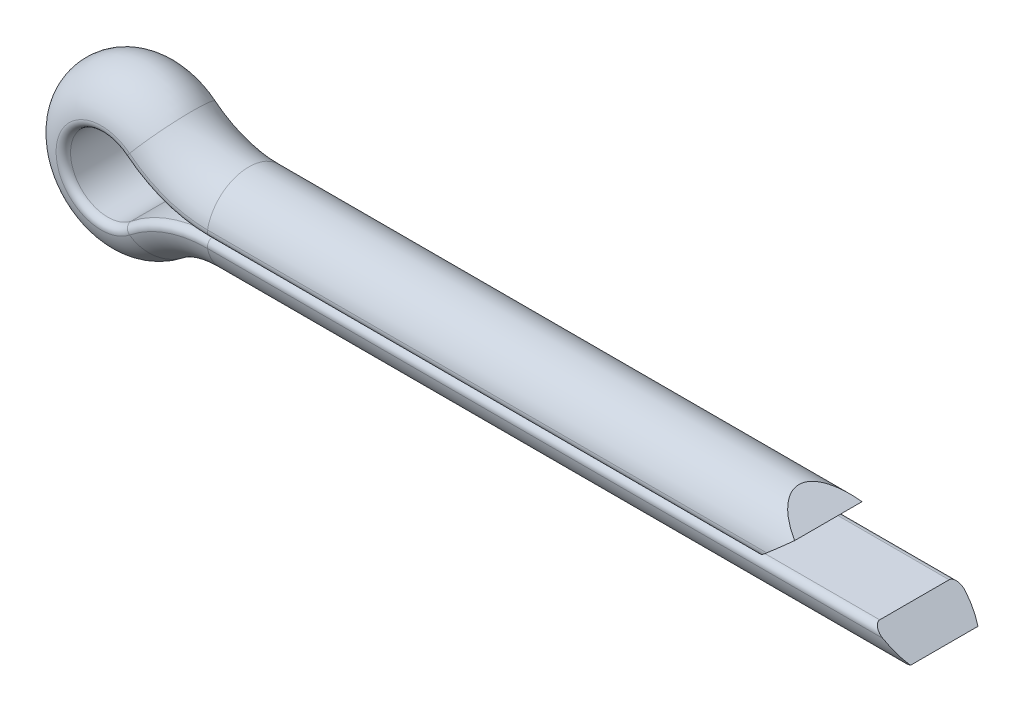
ISO-10303-21;
HEADER;
FILE_DESCRIPTION(('STEP AP214'),'2;1');
FILE_NAME('part.step','',(''),(''),'','','');
FILE_SCHEMA(('AUTOMOTIVE_DESIGN { 1 0 10303 214 1 1 1 1 }'));
ENDSEC;
DATA;
#1=APPLICATION_CONTEXT('core data for automotive mechanical design processes');
#2=APPLICATION_PROTOCOL_DEFINITION('international standard','automotive_design',2000,#1);
#3=PRODUCT_CONTEXT('',#1,'mechanical');
#4=PRODUCT('Part','Part','',(#3));
#5=PRODUCT_RELATED_PRODUCT_CATEGORY('part','',(#4));
#6=PRODUCT_DEFINITION_FORMATION('','',#4);
#7=PRODUCT_DEFINITION_CONTEXT('part definition',#1,'design');
#8=PRODUCT_DEFINITION('design','',#6,#7);
#9=PRODUCT_DEFINITION_SHAPE('','',#8);
#10=(LENGTH_UNIT() NAMED_UNIT(*) SI_UNIT(.MILLI.,.METRE.));
#11=(NAMED_UNIT(*) PLANE_ANGLE_UNIT() SI_UNIT($,.RADIAN.));
#12=(NAMED_UNIT(*) SI_UNIT($,.STERADIAN.) SOLID_ANGLE_UNIT());
#13=UNCERTAINTY_MEASURE_WITH_UNIT(LENGTH_MEASURE(1.E-05),#10,'distance_accuracy_value','');
#14=(GEOMETRIC_REPRESENTATION_CONTEXT(3) GLOBAL_UNCERTAINTY_ASSIGNED_CONTEXT((#13)) GLOBAL_UNIT_ASSIGNED_CONTEXT((#10,
#11,#12)) REPRESENTATION_CONTEXT('',''));
#15=CARTESIAN_POINT('',(0.,0.,0.));
#16=DIRECTION('',(0.,0.,1.));
#17=DIRECTION('',(1.,0.,0.));
#18=AXIS2_PLACEMENT_3D('',#15,#16,#17);
#19=CARTESIAN_POINT('',(3.66500000000001,0.,0.));
#20=DIRECTION('',(1.,0.,0.));
#21=DIRECTION('',(0.,0.,-1.));
#22=AXIS2_PLACEMENT_3D('',#19,#20,#21);
#23=CYLINDRICAL_SURFACE('',#22,1.45);
#24=CARTESIAN_POINT('',(29.1549658100971,0.,0.));
#25=DIRECTION('',(-0.501148088783706,0.865361538958393,0.));
#26=DIRECTION('',(0.865361538958393,0.501148088783706,0.));
#27=AXIS2_PLACEMENT_3D('',#24,#25,#26);
#28=ELLIPSE('',#27,2.89335634007739,1.45);
#29=CARTESIAN_POINT('',(27.665,-0.862868852459016,-1.16531426810799));
#30=VERTEX_POINT('',#29);
#31=CARTESIAN_POINT('',(27.665,-0.862868852459016,1.16531426810799));
#32=VERTEX_POINT('',#31);
#33=EDGE_CURVE('E171',#30,#32,#28,.T.);
#34=ORIENTED_EDGE('',*,*,#33,.T.);
#35=CARTESIAN_POINT('',(26.6338989335464,0.,0.));
#36=DIRECTION('',(-0.641771111317948,-0.766896238534084,0.));
#37=DIRECTION('',(0.766896238534084,-0.641771111317948,0.));
#38=AXIS2_PLACEMENT_3D('',#35,#36,#37);
#39=ELLIPSE('',#38,2.25937249967869,1.45);
#40=CARTESIAN_POINT('',(26.9633967950027,-0.275737704918033,1.42354090846963));
#41=VERTEX_POINT('',#40);
#42=EDGE_CURVE('E170',#32,#41,#39,.T.);
#43=ORIENTED_EDGE('',*,*,#42,.T.);
#44=DIRECTION('',(1.,0.,0.));
#45=VECTOR('',#44,1.);
#46=CARTESIAN_POINT('',(3.66500000000002,-0.275737704918033,1.42354090846963));
#47=LINE('',#46,#45);
#48=CARTESIAN_POINT('',(3.66500000000002,-0.275737704918033,1.42354090846963));
#49=VERTEX_POINT('',#48);
#50=EDGE_CURVE('E11',#49,#41,#47,.T.);
#51=ORIENTED_EDGE('',*,*,#50,.F.);
#52=CARTESIAN_POINT('',(3.66500000000001,0.,0.));
#53=DIRECTION('',(-1.,0.,0.));
#54=DIRECTION('',(0.,0.,-1.));
#55=AXIS2_PLACEMENT_3D('',#52,#53,#54);
#56=CIRCLE('',#55,1.45);
#57=CARTESIAN_POINT('',(3.66500000000002,-0.275737704918033,-1.42354090846963));
#58=VERTEX_POINT('',#57);
#59=EDGE_CURVE('E253',#58,#49,#56,.T.);
#60=ORIENTED_EDGE('',*,*,#59,.F.);
#61=DIRECTION('',(1.,0.,0.));
#62=VECTOR('',#61,1.);
#63=CARTESIAN_POINT('',(3.66500000000002,-0.275737704918033,-1.42354090846963));
#64=LINE('',#63,#62);
#65=CARTESIAN_POINT('',(26.9633967950027,-0.275737704918033,-1.42354090846963));
#66=VERTEX_POINT('',#65);
#67=EDGE_CURVE('E45',#58,#66,#64,.T.);
#68=ORIENTED_EDGE('',*,*,#67,.T.);
#69=EDGE_CURVE('E167',#66,#30,#39,.T.);
#70=ORIENTED_EDGE('',*,*,#69,.T.);
#71=EDGE_LOOP('',(#34,#43,#51,#60,#68,#70));
#72=FACE_BOUND('',#71,.T.);
#73=ADVANCED_FACE('F38',(#72),#23,.T.);
#74=CARTESIAN_POINT('',(3.66500000000002,-0.232000000000001,-1.19773786781583));
#75=DIRECTION('',(1.,0.,0.));
#76=DIRECTION('',(0.,0.,-1.));
#77=AXIS2_PLACEMENT_3D('',#74,#75,#76);
#78=CYLINDRICAL_SURFACE('',#77,0.23);
#79=CARTESIAN_POINT('',(26.9111316169786,-0.232000000000001,-1.19773786781583));
#80=DIRECTION('',(-0.641771111317948,-0.766896238534084,0.));
#81=DIRECTION('',(0.766896238534084,-0.641771111317948,0.));
#82=AXIS2_PLACEMENT_3D('',#79,#80,#81);
#83=ELLIPSE('',#82,0.358383224086964,0.23);
#84=CARTESIAN_POINT('',(26.6362888704726,-0.00200000000000005,-1.19773786781582));
#85=VERTEX_POINT('',#84);
#86=EDGE_CURVE('E165',#85,#66,#83,.T.);
#87=ORIENTED_EDGE('',*,*,#86,.T.);
#88=ORIENTED_EDGE('',*,*,#67,.F.);
#89=CARTESIAN_POINT('',(3.66500000000002,-0.232000000000001,-1.19773786781583));
#90=DIRECTION('',(-1.,0.,0.));
#91=DIRECTION('',(0.,0.,1.));
#92=AXIS2_PLACEMENT_3D('',#89,#90,#91);
#93=CIRCLE('',#92,0.23);
#94=CARTESIAN_POINT('',(3.66500000000001,-0.00200000000000005,-1.19773786781583));
#95=VERTEX_POINT('',#94);
#96=EDGE_CURVE('E250',#95,#58,#93,.T.);
#97=ORIENTED_EDGE('',*,*,#96,.F.);
#98=DIRECTION('',(1.,0.,0.));
#99=VECTOR('',#98,1.);
#100=CARTESIAN_POINT('',(3.66500000000001,-0.00200000000000005,-1.19773786781583));
#101=LINE('',#100,#99);
#102=EDGE_CURVE('E271',#95,#85,#101,.T.);
#103=ORIENTED_EDGE('',*,*,#102,.T.);
#104=EDGE_LOOP('',(#87,#88,#97,#103));
#105=FACE_BOUND('',#104,.T.);
#106=ADVANCED_FACE('F277',(#105),#78,.T.);
#107=CARTESIAN_POINT('',(3.66500000000001,-0.00200000000000005,1.19773786781583));
#108=DIRECTION('',(0.,-1.,0.));
#109=DIRECTION('',(0.,0.,-1.));
#110=AXIS2_PLACEMENT_3D('',#107,#108,#109);
#111=PLANE('',#110);
#112=DIRECTION('',(1.,0.,0.));
#113=VECTOR('',#112,1.);
#114=CARTESIAN_POINT('',(3.66500000000001,-0.00200000000000005,1.19773786781583));
#115=LINE('',#114,#113);
#116=CARTESIAN_POINT('',(3.66500000000001,-0.00200000000000005,1.19773786781583));
#117=VERTEX_POINT('',#116);
#118=CARTESIAN_POINT('',(26.6362888704726,-0.00200000000000005,1.19773786781583));
#119=VERTEX_POINT('',#118);
#120=EDGE_CURVE('E268',#117,#119,#115,.T.);
#121=ORIENTED_EDGE('',*,*,#120,.T.);
#122=DIRECTION('',(0.,0.,-1.));
#123=VECTOR('',#122,1.);
#124=CARTESIAN_POINT('',(26.6362888704726,-0.00200000000000005,1.19773786781583));
#125=LINE('',#124,#123);
#126=EDGE_CURVE('E159',#119,#85,#125,.T.);
#127=ORIENTED_EDGE('',*,*,#126,.T.);
#128=ORIENTED_EDGE('',*,*,#102,.F.);
#129=DIRECTION('',(0.,0.,-1.));
#130=VECTOR('',#129,1.);
#131=CARTESIAN_POINT('',(3.66500000000001,-0.00200000000000005,1.19773786781583));
#132=LINE('',#131,#130);
#133=EDGE_CURVE('E247',#117,#95,#132,.T.);
#134=ORIENTED_EDGE('',*,*,#133,.F.);
#135=EDGE_LOOP('',(#121,#127,#128,#134));
#136=FACE_BOUND('',#135,.T.);
#137=ADVANCED_FACE('F337',(#136),#111,.F.);
#138=CARTESIAN_POINT('',(3.66500000000002,-0.232000000000001,1.19773786781583));
#139=DIRECTION('',(1.,0.,0.));
#140=DIRECTION('',(0.,0.,-1.));
#141=AXIS2_PLACEMENT_3D('',#138,#139,#140);
#142=CYLINDRICAL_SURFACE('',#141,0.23);
#143=CARTESIAN_POINT('',(26.9111316169786,-0.232000000000001,1.19773786781583));
#144=DIRECTION('',(-0.641771111317948,-0.766896238534084,0.));
#145=DIRECTION('',(0.766896238534084,-0.641771111317948,0.));
#146=AXIS2_PLACEMENT_3D('',#143,#144,#145);
#147=ELLIPSE('',#146,0.358383224086964,0.23);
#148=EDGE_CURVE('E157',#41,#119,#147,.T.);
#149=ORIENTED_EDGE('',*,*,#148,.T.);
#150=ORIENTED_EDGE('',*,*,#120,.F.);
#151=CARTESIAN_POINT('',(3.66500000000002,-0.232000000000001,1.19773786781583));
#152=DIRECTION('',(-1.,0.,0.));
#153=DIRECTION('',(0.,0.,1.));
#154=AXIS2_PLACEMENT_3D('',#151,#152,#153);
#155=CIRCLE('',#154,0.23);
#156=EDGE_CURVE('E244',#49,#117,#155,.T.);
#157=ORIENTED_EDGE('',*,*,#156,.F.);
#158=ORIENTED_EDGE('',*,*,#50,.T.);
#159=EDGE_LOOP('',(#149,#150,#157,#158));
#160=FACE_BOUND('',#159,.T.);
#161=ADVANCED_FACE('F334',(#160),#142,.T.);
#162=CARTESIAN_POINT('',(3.665,-4.58404669260701,0.));
#163=DIRECTION('',(0.,0.,-1.));
#164=DIRECTION('',(-1.,0.,0.));
#165=AXIS2_PLACEMENT_3D('',#162,#163,#164);
#166=TOROIDAL_SURFACE('',#165,4.58404669260701,1.45);
#167=CARTESIAN_POINT('',(0.802434406584711,-1.00365533084274,0.));
#168=DIRECTION('',(-0.781054732173332,-0.624462573217678,0.));
#169=DIRECTION('',(0.,0.,-1.));
#170=AXIS2_PLACEMENT_3D('',#167,#168,#169);
#171=CIRCLE('',#170,1.45);
#172=CARTESIAN_POINT('',(0.974622283330962,-1.21902157010758,-1.42354090846963));
#173=VERTEX_POINT('',#172);
#174=CARTESIAN_POINT('',(0.974622283330962,-1.21902157010758,1.42354090846963));
#175=VERTEX_POINT('',#174);
#176=EDGE_CURVE('E229',#173,#175,#171,.T.);
#177=ORIENTED_EDGE('',*,*,#176,.F.);
#178=CARTESIAN_POINT('',(3.665,-4.58404669260701,-1.42354090846963));
#179=DIRECTION('',(0.,0.,-1.));
#180=DIRECTION('',(-1.,0.,0.));
#181=AXIS2_PLACEMENT_3D('',#178,#179,#180);
#182=CIRCLE('',#181,4.30830898768897);
#183=EDGE_CURVE('E262',#173,#58,#182,.T.);
#184=ORIENTED_EDGE('',*,*,#183,.T.);
#185=ORIENTED_EDGE('',*,*,#59,.T.);
#186=CARTESIAN_POINT('',(3.665,-4.58404669260701,1.42354090846963));
#187=DIRECTION('',(0.,0.,-1.));
#188=DIRECTION('',(-1.,0.,0.));
#189=AXIS2_PLACEMENT_3D('',#186,#187,#188);
#190=CIRCLE('',#189,4.30830898768897);
#191=EDGE_CURVE('E265',#175,#49,#190,.T.);
#192=ORIENTED_EDGE('',*,*,#191,.F.);
#193=EDGE_LOOP('',(#177,#184,#185,#192));
#194=FACE_BOUND('',#193,.T.);
#195=ADVANCED_FACE('F319',(#194),#166,.T.);
#196=CARTESIAN_POINT('',(3.665,-4.58404669260701,-1.19773786781583));
#197=DIRECTION('',(0.,0.,-1.));
#198=DIRECTION('',(-1.,0.,0.));
#199=AXIS2_PLACEMENT_3D('',#196,#197,#198);
#200=TOROIDAL_SURFACE('',#199,4.35204669260701,0.23);
#201=CARTESIAN_POINT('',(0.947309723571212,-1.18486002870695,-1.19773786781583));
#202=DIRECTION('',(-0.781054732173332,-0.624462573217678,0.));
#203=DIRECTION('',(0.,0.,1.));
#204=AXIS2_PLACEMENT_3D('',#201,#202,#203);
#205=CIRCLE('',#204,0.23);
#206=CARTESIAN_POINT('',(0.803683331731146,-1.00521744030708,-1.19773786781583));
#207=VERTEX_POINT('',#206);
#208=EDGE_CURVE('E226',#207,#173,#205,.T.);
#209=ORIENTED_EDGE('',*,*,#208,.F.);
#210=CARTESIAN_POINT('',(3.665,-4.58404669260701,-1.19773786781583));
#211=DIRECTION('',(0.,0.,-1.));
#212=DIRECTION('',(-1.,0.,0.));
#213=AXIS2_PLACEMENT_3D('',#210,#211,#212);
#214=CIRCLE('',#213,4.58204669260701);
#215=EDGE_CURVE('E259',#207,#95,#214,.T.);
#216=ORIENTED_EDGE('',*,*,#215,.T.);
#217=ORIENTED_EDGE('',*,*,#96,.T.);
#218=ORIENTED_EDGE('',*,*,#183,.F.);
#219=EDGE_LOOP('',(#209,#216,#217,#218));
#220=FACE_BOUND('',#219,.T.);
#221=ADVANCED_FACE('F325',(#220),#200,.T.);
#222=CARTESIAN_POINT('',(3.665,-4.58404669260701,0.));
#223=DIRECTION('',(0.,0.,-1.));
#224=DIRECTION('',(-1.,0.,0.));
#225=AXIS2_PLACEMENT_3D('',#222,#223,#224);
#226=CYLINDRICAL_SURFACE('',#225,4.58204669260701);
#227=DIRECTION('',(0.,0.,-1.));
#228=VECTOR('',#227,1.);
#229=CARTESIAN_POINT('',(0.803683331731146,-1.00521744030708,1.19773786781583));
#230=LINE('',#229,#228);
#231=CARTESIAN_POINT('',(0.803683331731146,-1.00521744030708,1.19773786781583));
#232=VERTEX_POINT('',#231);
#233=EDGE_CURVE('E223',#232,#207,#230,.T.);
#234=ORIENTED_EDGE('',*,*,#233,.F.);
#235=CARTESIAN_POINT('',(3.665,-4.58404669260701,1.19773786781583));
#236=DIRECTION('',(0.,0.,-1.));
#237=DIRECTION('',(-1.,0.,0.));
#238=AXIS2_PLACEMENT_3D('',#235,#236,#237);
#239=CIRCLE('',#238,4.58204669260701);
#240=EDGE_CURVE('E256',#232,#117,#239,.T.);
#241=ORIENTED_EDGE('',*,*,#240,.T.);
#242=ORIENTED_EDGE('',*,*,#133,.T.);
#243=ORIENTED_EDGE('',*,*,#215,.F.);
#244=EDGE_LOOP('',(#234,#241,#242,#243));
#245=FACE_BOUND('',#244,.T.);
#246=ADVANCED_FACE('F330',(#245),#226,.T.);
#247=CARTESIAN_POINT('',(3.665,-4.58404669260701,1.19773786781583));
#248=DIRECTION('',(0.,0.,-1.));
#249=DIRECTION('',(-1.,0.,0.));
#250=AXIS2_PLACEMENT_3D('',#247,#248,#249);
#251=TOROIDAL_SURFACE('',#250,4.35204669260701,0.23);
#252=CARTESIAN_POINT('',(0.947309723571212,-1.18486002870695,1.19773786781583));
#253=DIRECTION('',(-0.781054732173332,-0.624462573217678,0.));
#254=DIRECTION('',(0.,0.,1.));
#255=AXIS2_PLACEMENT_3D('',#252,#253,#254);
#256=CIRCLE('',#255,0.23);
#257=EDGE_CURVE('E220',#175,#232,#256,.T.);
#258=ORIENTED_EDGE('',*,*,#257,.F.);
#259=ORIENTED_EDGE('',*,*,#191,.T.);
#260=ORIENTED_EDGE('',*,*,#156,.T.);
#261=ORIENTED_EDGE('',*,*,#240,.F.);
#262=EDGE_LOOP('',(#258,#259,#260,#261));
#263=FACE_BOUND('',#262,.T.);
#264=ADVANCED_FACE('F332',(#263),#251,.T.);
#265=CARTESIAN_POINT('',(0.,0.,0.));
#266=DIRECTION('',(0.,0.,1.));
#267=DIRECTION('',(1.,0.,0.));
#268=AXIS2_PLACEMENT_3D('',#265,#266,#267);
#269=DEGENERATE_TOROIDAL_SURFACE('',#268,1.285,1.45,.T.);
#270=CARTESIAN_POINT('',(0.802434406584704,1.00365533084274,0.));
#271=DIRECTION('',(0.781054732173343,-0.624462573217665,0.));
#272=DIRECTION('',(0.,0.,-1.));
#273=AXIS2_PLACEMENT_3D('',#270,#271,#272);
#274=CIRCLE('',#273,1.45);
#275=CARTESIAN_POINT('',(0.974622283330952,1.21902157010759,-1.42354090846963));
#276=VERTEX_POINT('',#275);
#277=CARTESIAN_POINT('',(0.974622283330952,1.21902157010759,1.42354090846963));
#278=VERTEX_POINT('',#277);
#279=EDGE_CURVE('E205',#276,#278,#274,.T.);
#280=ORIENTED_EDGE('',*,*,#279,.F.);
#281=CARTESIAN_POINT('',(0.,0.,-1.42354090846963));
#282=DIRECTION('',(0.,0.,1.));
#283=DIRECTION('',(1.,0.,0.));
#284=AXIS2_PLACEMENT_3D('',#281,#282,#283);
#285=CIRCLE('',#284,1.56073770491803);
#286=EDGE_CURVE('E238',#276,#173,#285,.T.);
#287=ORIENTED_EDGE('',*,*,#286,.T.);
#288=ORIENTED_EDGE('',*,*,#176,.T.);
#289=CARTESIAN_POINT('',(0.,0.,1.42354090846963));
#290=DIRECTION('',(0.,0.,1.));
#291=DIRECTION('',(1.,0.,0.));
#292=AXIS2_PLACEMENT_3D('',#289,#290,#291);
#293=CIRCLE('',#292,1.56073770491803);
#294=EDGE_CURVE('E241',#278,#175,#293,.T.);
#295=ORIENTED_EDGE('',*,*,#294,.F.);
#296=EDGE_LOOP('',(#280,#287,#288,#295));
#297=FACE_BOUND('',#296,.T.);
#298=ADVANCED_FACE('F316',(#297),#269,.T.);
#299=CARTESIAN_POINT('',(0.,0.,-1.19773786781583));
#300=DIRECTION('',(0.,0.,1.));
#301=DIRECTION('',(1.,0.,0.));
#302=AXIS2_PLACEMENT_3D('',#299,#300,#301);
#303=TOROIDAL_SURFACE('',#302,1.517,0.23);
#304=CARTESIAN_POINT('',(0.947309723571202,1.18486002870696,-1.19773786781583));
#305=DIRECTION('',(0.781054732173343,-0.624462573217665,0.));
#306=DIRECTION('',(0.,0.,1.));
#307=AXIS2_PLACEMENT_3D('',#304,#305,#306);
#308=CIRCLE('',#307,0.23);
#309=CARTESIAN_POINT('',(0.803683331731139,1.00521744030709,-1.19773786781583));
#310=VERTEX_POINT('',#309);
#311=EDGE_CURVE('E202',#310,#276,#308,.T.);
#312=ORIENTED_EDGE('',*,*,#311,.F.);
#313=CARTESIAN_POINT('',(0.,0.,-1.19773786781583));
#314=DIRECTION('',(0.,0.,1.));
#315=DIRECTION('',(1.,0.,0.));
#316=AXIS2_PLACEMENT_3D('',#313,#314,#315);
#317=CIRCLE('',#316,1.287);
#318=EDGE_CURVE('E235',#310,#207,#317,.T.);
#319=ORIENTED_EDGE('',*,*,#318,.T.);
#320=ORIENTED_EDGE('',*,*,#208,.T.);
#321=ORIENTED_EDGE('',*,*,#286,.F.);
#322=EDGE_LOOP('',(#312,#319,#320,#321));
#323=FACE_BOUND('',#322,.T.);
#324=ADVANCED_FACE('F323',(#323),#303,.T.);
#325=CARTESIAN_POINT('',(0.,0.,0.));
#326=DIRECTION('',(0.,0.,1.));
#327=DIRECTION('',(1.,0.,0.));
#328=AXIS2_PLACEMENT_3D('',#325,#326,#327);
#329=CYLINDRICAL_SURFACE('',#328,1.287);
#330=DIRECTION('',(0.,0.,-1.));
#331=VECTOR('',#330,1.);
#332=CARTESIAN_POINT('',(0.803683331731139,1.00521744030709,1.19773786781583));
#333=LINE('',#332,#331);
#334=CARTESIAN_POINT('',(0.803683331731139,1.00521744030709,1.19773786781583));
#335=VERTEX_POINT('',#334);
#336=EDGE_CURVE('E199',#335,#310,#333,.T.);
#337=ORIENTED_EDGE('',*,*,#336,.F.);
#338=CARTESIAN_POINT('',(0.,0.,1.19773786781583));
#339=DIRECTION('',(0.,0.,1.));
#340=DIRECTION('',(1.,0.,0.));
#341=AXIS2_PLACEMENT_3D('',#338,#339,#340);
#342=CIRCLE('',#341,1.287);
#343=EDGE_CURVE('E232',#335,#232,#342,.T.);
#344=ORIENTED_EDGE('',*,*,#343,.T.);
#345=ORIENTED_EDGE('',*,*,#233,.T.);
#346=ORIENTED_EDGE('',*,*,#318,.F.);
#347=EDGE_LOOP('',(#337,#344,#345,#346));
#348=FACE_BOUND('',#347,.T.);
#349=ADVANCED_FACE('F328',(#348),#329,.F.);
#350=CARTESIAN_POINT('',(0.,0.,1.19773786781583));
#351=DIRECTION('',(0.,0.,1.));
#352=DIRECTION('',(1.,0.,0.));
#353=AXIS2_PLACEMENT_3D('',#350,#351,#352);
#354=TOROIDAL_SURFACE('',#353,1.517,0.23);
#355=CARTESIAN_POINT('',(0.947309723571202,1.18486002870696,1.19773786781583));
#356=DIRECTION('',(0.781054732173343,-0.624462573217665,0.));
#357=DIRECTION('',(0.,0.,1.));
#358=AXIS2_PLACEMENT_3D('',#355,#356,#357);
#359=CIRCLE('',#358,0.23);
#360=EDGE_CURVE('E189',#278,#335,#359,.T.);
#361=ORIENTED_EDGE('',*,*,#360,.F.);
#362=ORIENTED_EDGE('',*,*,#294,.T.);
#363=ORIENTED_EDGE('',*,*,#257,.T.);
#364=ORIENTED_EDGE('',*,*,#343,.F.);
#365=EDGE_LOOP('',(#361,#362,#363,#364));
#366=FACE_BOUND('',#365,.T.);
#367=ADVANCED_FACE('F313',(#366),#354,.T.);
#368=CARTESIAN_POINT('',(3.665,4.58404669260701,0.));
#369=DIRECTION('',(0.,0.,-1.));
#370=DIRECTION('',(-1.,0.,0.));
#371=AXIS2_PLACEMENT_3D('',#368,#369,#370);
#372=TOROIDAL_SURFACE('',#371,4.58404669260701,1.45);
#373=CARTESIAN_POINT('',(3.665,0.,0.));
#374=DIRECTION('',(1.,0.,0.));
#375=DIRECTION('',(0.,0.,-1.));
#376=AXIS2_PLACEMENT_3D('',#373,#374,#375);
#377=CIRCLE('',#376,1.45);
#378=CARTESIAN_POINT('',(3.665,0.275737704918033,-1.42354090846963));
#379=VERTEX_POINT('',#378);
#380=CARTESIAN_POINT('',(3.665,0.275737704918032,1.42354090846963));
#381=VERTEX_POINT('',#380);
#382=EDGE_CURVE('E183',#379,#381,#377,.T.);
#383=ORIENTED_EDGE('',*,*,#382,.F.);
#384=CARTESIAN_POINT('',(3.665,4.58404669260701,-1.42354090846963));
#385=DIRECTION('',(0.,0.,-1.));
#386=DIRECTION('',(-1.,0.,0.));
#387=AXIS2_PLACEMENT_3D('',#384,#385,#386);
#388=CIRCLE('',#387,4.30830898768897);
#389=EDGE_CURVE('E214',#379,#276,#388,.T.);
#390=ORIENTED_EDGE('',*,*,#389,.T.);
#391=ORIENTED_EDGE('',*,*,#279,.T.);
#392=CARTESIAN_POINT('',(3.665,4.58404669260701,1.42354090846963));
#393=DIRECTION('',(0.,0.,-1.));
#394=DIRECTION('',(-1.,0.,0.));
#395=AXIS2_PLACEMENT_3D('',#392,#393,#394);
#396=CIRCLE('',#395,4.30830898768897);
#397=EDGE_CURVE('E217',#381,#278,#396,.T.);
#398=ORIENTED_EDGE('',*,*,#397,.F.);
#399=EDGE_LOOP('',(#383,#390,#391,#398));
#400=FACE_BOUND('',#399,.T.);
#401=ADVANCED_FACE('F304',(#400),#372,.T.);
#402=CARTESIAN_POINT('',(3.665,4.58404669260701,-1.19773786781583));
#403=DIRECTION('',(0.,0.,-1.));
#404=DIRECTION('',(-1.,0.,0.));
#405=AXIS2_PLACEMENT_3D('',#402,#403,#404);
#406=TOROIDAL_SURFACE('',#405,4.35204669260701,0.23);
#407=CARTESIAN_POINT('',(3.665,0.232,-1.19773786781583));
#408=DIRECTION('',(1.,0.,0.));
#409=DIRECTION('',(0.,0.,1.));
#410=AXIS2_PLACEMENT_3D('',#407,#408,#409);
#411=CIRCLE('',#410,0.23);
#412=CARTESIAN_POINT('',(3.665,0.00200000000000005,-1.19773786781583));
#413=VERTEX_POINT('',#412);
#414=EDGE_CURVE('E180',#413,#379,#411,.T.);
#415=ORIENTED_EDGE('',*,*,#414,.F.);
#416=CARTESIAN_POINT('',(3.665,4.58404669260701,-1.19773786781583));
#417=DIRECTION('',(0.,0.,-1.));
#418=DIRECTION('',(-1.,0.,0.));
#419=AXIS2_PLACEMENT_3D('',#416,#417,#418);
#420=CIRCLE('',#419,4.58204669260701);
#421=EDGE_CURVE('E211',#413,#310,#420,.T.);
#422=ORIENTED_EDGE('',*,*,#421,.T.);
#423=ORIENTED_EDGE('',*,*,#311,.T.);
#424=ORIENTED_EDGE('',*,*,#389,.F.);
#425=EDGE_LOOP('',(#415,#422,#423,#424));
#426=FACE_BOUND('',#425,.T.);
#427=ADVANCED_FACE('F300',(#426),#406,.T.);
#428=CARTESIAN_POINT('',(3.665,4.58404669260701,0.));
#429=DIRECTION('',(0.,0.,-1.));
#430=DIRECTION('',(-1.,0.,0.));
#431=AXIS2_PLACEMENT_3D('',#428,#429,#430);
#432=CYLINDRICAL_SURFACE('',#431,4.58204669260701);
#433=DIRECTION('',(0.,0.,-1.));
#434=VECTOR('',#433,1.);
#435=CARTESIAN_POINT('',(3.665,0.00200000000000005,1.19773786781583));
#436=LINE('',#435,#434);
#437=CARTESIAN_POINT('',(3.665,0.00200000000000005,1.19773786781583));
#438=VERTEX_POINT('',#437);
#439=EDGE_CURVE('E177',#438,#413,#436,.T.);
#440=ORIENTED_EDGE('',*,*,#439,.F.);
#441=CARTESIAN_POINT('',(3.665,4.58404669260701,1.19773786781583));
#442=DIRECTION('',(0.,0.,-1.));
#443=DIRECTION('',(-1.,0.,0.));
#444=AXIS2_PLACEMENT_3D('',#441,#442,#443);
#445=CIRCLE('',#444,4.58204669260701);
#446=EDGE_CURVE('E208',#438,#335,#445,.T.);
#447=ORIENTED_EDGE('',*,*,#446,.T.);
#448=ORIENTED_EDGE('',*,*,#336,.T.);
#449=ORIENTED_EDGE('',*,*,#421,.F.);
#450=EDGE_LOOP('',(#440,#447,#448,#449));
#451=FACE_BOUND('',#450,.T.);
#452=ADVANCED_FACE('F296',(#451),#432,.T.);
#453=CARTESIAN_POINT('',(3.665,4.58404669260701,1.19773786781583));
#454=DIRECTION('',(0.,0.,-1.));
#455=DIRECTION('',(-1.,0.,0.));
#456=AXIS2_PLACEMENT_3D('',#453,#454,#455);
#457=TOROIDAL_SURFACE('',#456,4.35204669260701,0.23);
#458=CARTESIAN_POINT('',(3.665,0.232,1.19773786781583));
#459=DIRECTION('',(1.,0.,0.));
#460=DIRECTION('',(0.,0.,1.));
#461=AXIS2_PLACEMENT_3D('',#458,#459,#460);
#462=CIRCLE('',#461,0.23);
#463=EDGE_CURVE('E174',#381,#438,#462,.T.);
#464=ORIENTED_EDGE('',*,*,#463,.F.);
#465=ORIENTED_EDGE('',*,*,#397,.T.);
#466=ORIENTED_EDGE('',*,*,#360,.T.);
#467=ORIENTED_EDGE('',*,*,#446,.F.);
#468=EDGE_LOOP('',(#464,#465,#466,#467));
#469=FACE_BOUND('',#468,.T.);
#470=ADVANCED_FACE('F310',(#469),#457,.T.);
#471=CARTESIAN_POINT('',(3.665,0.232,1.19773786781583));
#472=DIRECTION('',(1.,0.,0.));
#473=DIRECTION('',(0.,0.,-1.));
#474=AXIS2_PLACEMENT_3D('',#471,#472,#473);
#475=CYLINDRICAL_SURFACE('',#474,0.23);
#476=DIRECTION('',(1.,0.,0.));
#477=VECTOR('',#476,1.);
#478=CARTESIAN_POINT('',(3.665,0.00200000000000005,1.19773786781583));
#479=LINE('',#478,#477);
#480=CARTESIAN_POINT('',(22.6362888704725,0.00200000000000005,1.19773786781583));
#481=VERTEX_POINT('',#480);
#482=EDGE_CURVE('E186',#438,#481,#479,.T.);
#483=ORIENTED_EDGE('',*,*,#482,.T.);
#484=CARTESIAN_POINT('',(22.9111316169786,0.232,1.19773786781583));
#485=DIRECTION('',(-0.641771111317948,0.766896238534084,0.));
#486=DIRECTION('',(0.766896238534084,0.641771111317948,0.));
#487=AXIS2_PLACEMENT_3D('',#484,#485,#486);
#488=ELLIPSE('',#487,0.358383224086964,0.23);
#489=CARTESIAN_POINT('',(22.9633967950027,0.275737704918032,1.42354090846963));
#490=VERTEX_POINT('',#489);
#491=EDGE_CURVE('E52',#490,#481,#488,.F.);
#492=ORIENTED_EDGE('',*,*,#491,.F.);
#493=DIRECTION('',(1.,0.,0.));
#494=VECTOR('',#493,1.);
#495=CARTESIAN_POINT('',(3.665,0.275737704918032,1.42354090846963));
#496=LINE('',#495,#494);
#497=EDGE_CURVE('E187',#381,#490,#496,.T.);
#498=ORIENTED_EDGE('',*,*,#497,.F.);
#499=ORIENTED_EDGE('',*,*,#463,.T.);
#500=EDGE_LOOP('',(#483,#492,#498,#499));
#501=FACE_BOUND('',#500,.T.);
#502=ADVANCED_FACE('F308',(#501),#475,.T.);
#503=CARTESIAN_POINT('',(3.665,0.,0.));
#504=DIRECTION('',(1.,0.,0.));
#505=DIRECTION('',(0.,0.,-1.));
#506=AXIS2_PLACEMENT_3D('',#503,#504,#505);
#507=CYLINDRICAL_SURFACE('',#506,1.45);
#508=CARTESIAN_POINT('',(22.6338989335464,0.,0.));
#509=DIRECTION('',(-0.641771111317948,0.766896238534084,0.));
#510=DIRECTION('',(0.766896238534084,0.641771111317948,0.));
#511=AXIS2_PLACEMENT_3D('',#508,#509,#510);
#512=ELLIPSE('',#511,2.25937249967869,1.45);
#513=CARTESIAN_POINT('',(23.665,0.862868852459016,1.16531426810799));
#514=VERTEX_POINT('',#513);
#515=EDGE_CURVE('E149',#514,#490,#512,.F.);
#516=ORIENTED_EDGE('',*,*,#515,.F.);
#517=CARTESIAN_POINT('',(25.154965810097,0.,0.));
#518=DIRECTION('',(-0.501148088783706,-0.865361538958393,0.));
#519=DIRECTION('',(0.865361538958393,-0.501148088783706,0.));
#520=AXIS2_PLACEMENT_3D('',#517,#518,#519);
#521=ELLIPSE('',#520,2.89335634007739,1.45);
#522=CARTESIAN_POINT('',(23.665,0.862868852459016,-1.16531426810799));
#523=VERTEX_POINT('',#522);
#524=EDGE_CURVE('E152',#523,#514,#521,.F.);
#525=ORIENTED_EDGE('',*,*,#524,.F.);
#526=CARTESIAN_POINT('',(22.9633967950027,0.275737704918033,-1.42354090846963));
#527=VERTEX_POINT('',#526);
#528=EDGE_CURVE('E137',#527,#523,#512,.F.);
#529=ORIENTED_EDGE('',*,*,#528,.F.);
#530=DIRECTION('',(1.,0.,0.));
#531=VECTOR('',#530,1.);
#532=CARTESIAN_POINT('',(3.665,0.275737704918033,-1.42354090846963));
#533=LINE('',#532,#531);
#534=EDGE_CURVE('E190',#379,#527,#533,.T.);
#535=ORIENTED_EDGE('',*,*,#534,.F.);
#536=ORIENTED_EDGE('',*,*,#382,.T.);
#537=ORIENTED_EDGE('',*,*,#497,.T.);
#538=EDGE_LOOP('',(#516,#525,#529,#535,#536,#537));
#539=FACE_BOUND('',#538,.T.);
#540=ADVANCED_FACE('F155',(#539),#507,.T.);
#541=CARTESIAN_POINT('',(3.665,0.232,-1.19773786781583));
#542=DIRECTION('',(1.,0.,0.));
#543=DIRECTION('',(0.,0.,-1.));
#544=AXIS2_PLACEMENT_3D('',#541,#542,#543);
#545=CYLINDRICAL_SURFACE('',#544,0.23);
#546=ORIENTED_EDGE('',*,*,#534,.T.);
#547=CARTESIAN_POINT('',(22.9111316169786,0.232,-1.19773786781583));
#548=DIRECTION('',(-0.641771111317948,0.766896238534084,0.));
#549=DIRECTION('',(0.766896238534084,0.641771111317948,0.));
#550=AXIS2_PLACEMENT_3D('',#547,#548,#549);
#551=ELLIPSE('',#550,0.358383224086964,0.23);
#552=CARTESIAN_POINT('',(22.6362888704725,0.00200000000000005,-1.19773786781583));
#553=VERTEX_POINT('',#552);
#554=EDGE_CURVE('E143',#553,#527,#551,.F.);
#555=ORIENTED_EDGE('',*,*,#554,.F.);
#556=DIRECTION('',(1.,0.,0.));
#557=VECTOR('',#556,1.);
#558=CARTESIAN_POINT('',(3.665,0.00200000000000005,-1.19773786781583));
#559=LINE('',#558,#557);
#560=EDGE_CURVE('E192',#413,#553,#559,.T.);
#561=ORIENTED_EDGE('',*,*,#560,.F.);
#562=ORIENTED_EDGE('',*,*,#414,.T.);
#563=EDGE_LOOP('',(#546,#555,#561,#562));
#564=FACE_BOUND('',#563,.T.);
#565=ADVANCED_FACE('F292',(#564),#545,.T.);
#566=CARTESIAN_POINT('',(3.665,0.00200000000000005,1.19773786781583));
#567=DIRECTION('',(0.,-1.,0.));
#568=DIRECTION('',(0.,0.,-1.));
#569=AXIS2_PLACEMENT_3D('',#566,#567,#568);
#570=PLANE('',#569);
#571=DIRECTION('',(0.,0.,-1.));
#572=VECTOR('',#571,1.);
#573=CARTESIAN_POINT('',(22.6362888704725,0.00200000000000005,1.19773786781583));
#574=LINE('',#573,#572);
#575=EDGE_CURVE('E284',#481,#553,#574,.T.);
#576=ORIENTED_EDGE('',*,*,#575,.F.);
#577=ORIENTED_EDGE('',*,*,#482,.F.);
#578=ORIENTED_EDGE('',*,*,#439,.T.);
#579=ORIENTED_EDGE('',*,*,#560,.T.);
#580=EDGE_LOOP('',(#576,#577,#578,#579));
#581=FACE_BOUND('',#580,.T.);
#582=ADVANCED_FACE('F293',(#581),#570,.T.);
#583=CARTESIAN_POINT('',(23.665,0.862868852459016,-1.42773786781583));
#584=DIRECTION('',(-0.641771111317948,0.766896238534084,0.));
#585=DIRECTION('',(-0.766896238534084,-0.641771111317948,0.));
#586=AXIS2_PLACEMENT_3D('',#583,#584,#585);
#587=PLANE('',#586);
#588=ORIENTED_EDGE('',*,*,#515,.T.);
#589=ORIENTED_EDGE('',*,*,#491,.T.);
#590=ORIENTED_EDGE('',*,*,#575,.T.);
#591=ORIENTED_EDGE('',*,*,#554,.T.);
#592=ORIENTED_EDGE('',*,*,#528,.T.);
#593=DIRECTION('',(0.,0.,1.));
#594=VECTOR('',#593,1.);
#595=CARTESIAN_POINT('',(23.665,0.862868852459016,-1.42773786781583));
#596=LINE('',#595,#594);
#597=EDGE_CURVE('E140',#523,#514,#596,.T.);
#598=ORIENTED_EDGE('',*,*,#597,.T.);
#599=EDGE_LOOP('',(#588,#589,#590,#591,#592,#598));
#600=FACE_BOUND('',#599,.T.);
#601=ADVANCED_FACE('F139',(#600),#587,.F.);
#602=CARTESIAN_POINT('',(22.6338989335464,1.46,-1.42773786781583));
#603=DIRECTION('',(-0.501148088783706,-0.865361538958393,0.));
#604=DIRECTION('',(0.865361538958393,-0.501148088783706,0.));
#605=AXIS2_PLACEMENT_3D('',#602,#603,#604);
#606=PLANE('',#605);
#607=ORIENTED_EDGE('',*,*,#524,.T.);
#608=ORIENTED_EDGE('',*,*,#597,.F.);
#609=EDGE_LOOP('',(#607,#608));
#610=FACE_BOUND('',#609,.T.);
#611=ADVANCED_FACE('F151',(#610),#606,.F.);
#612=CARTESIAN_POINT('',(27.665,-0.862868852459016,-1.42773786781583));
#613=DIRECTION('',(-0.501148088783706,0.865361538958393,0.));
#614=DIRECTION('',(-0.865361538958393,-0.501148088783706,0.));
#615=AXIS2_PLACEMENT_3D('',#612,#613,#614);
#616=PLANE('',#615);
#617=DIRECTION('',(0.,0.,1.));
#618=VECTOR('',#617,1.);
#619=CARTESIAN_POINT('',(27.665,-0.862868852459016,-1.42773786781583));
#620=LINE('',#619,#618);
#621=EDGE_CURVE('E153',#30,#32,#620,.T.);
#622=ORIENTED_EDGE('',*,*,#621,.T.);
#623=ORIENTED_EDGE('',*,*,#33,.F.);
#624=EDGE_LOOP('',(#622,#623));
#625=FACE_BOUND('',#624,.T.);
#626=ADVANCED_FACE('F338',(#625),#616,.F.);
#627=CARTESIAN_POINT('',(26.6338989335464,0.,-1.42773786781583));
#628=DIRECTION('',(-0.641771111317948,-0.766896238534084,0.));
#629=DIRECTION('',(0.766896238534084,-0.641771111317948,0.));
#630=AXIS2_PLACEMENT_3D('',#627,#628,#629);
#631=PLANE('',#630);
#632=ORIENTED_EDGE('',*,*,#621,.F.);
#633=ORIENTED_EDGE('',*,*,#69,.F.);
#634=ORIENTED_EDGE('',*,*,#86,.F.);
#635=ORIENTED_EDGE('',*,*,#126,.F.);
#636=ORIENTED_EDGE('',*,*,#148,.F.);
#637=ORIENTED_EDGE('',*,*,#42,.F.);
#638=EDGE_LOOP('',(#632,#633,#634,#635,#636,#637));
#639=FACE_BOUND('',#638,.T.);
#640=ADVANCED_FACE('F281',(#639),#631,.F.);
#641=CLOSED_SHELL('',(#73,#106,#137,#161,#195,#221,#246,#264,#298,#324,#349,#367,#401,#427,#452,
#470,#502,#540,#565,#582,#601,#611,#626,#640));
#642=MANIFOLD_SOLID_BREP('B2',#641);
#643=ADVANCED_BREP_SHAPE_REPRESENTATION('',(#18,#642),#14);
#644=SHAPE_DEFINITION_REPRESENTATION(#9,#643);
ENDSEC;
END-ISO-10303-21;
